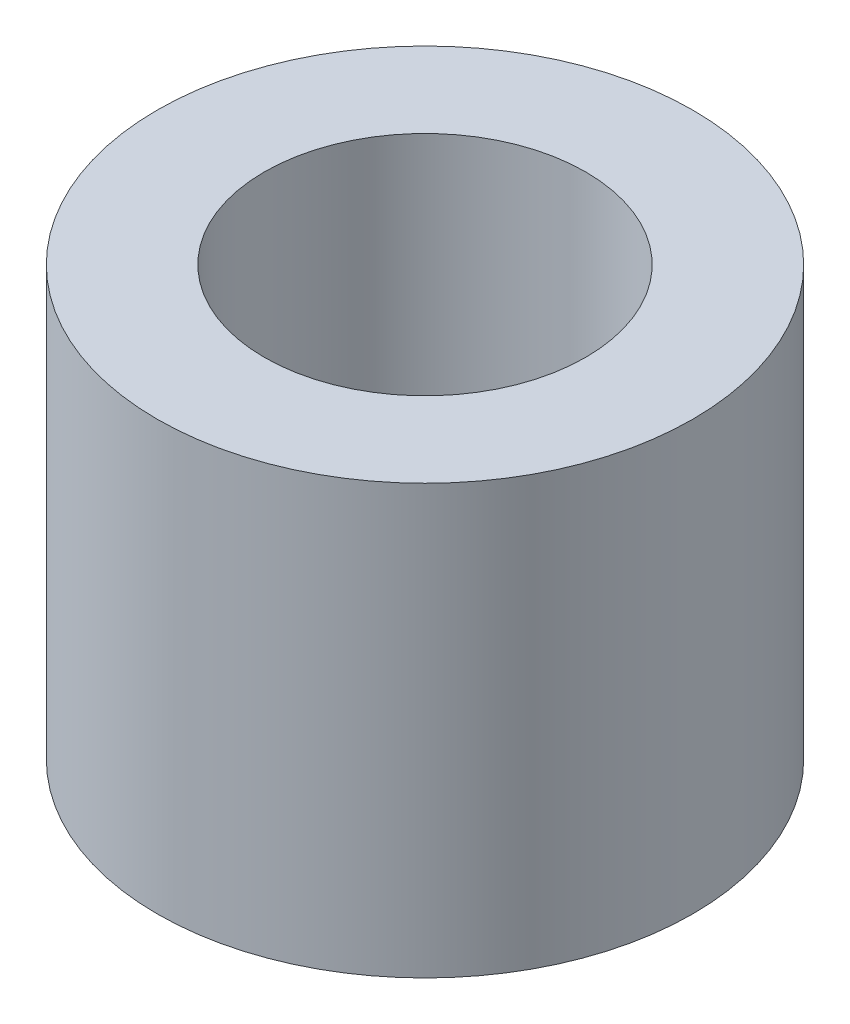
ISO-10303-21;
HEADER;
FILE_DESCRIPTION(('STEP AP214'),'2;1');
FILE_NAME('part.step','',(''),(''),'','','');
FILE_SCHEMA(('AUTOMOTIVE_DESIGN { 1 0 10303 214 1 1 1 1 }'));
ENDSEC;
DATA;
#1=APPLICATION_CONTEXT('core data for automotive mechanical design processes');
#2=APPLICATION_PROTOCOL_DEFINITION('international standard','automotive_design',2000,#1);
#3=PRODUCT_CONTEXT('',#1,'mechanical');
#4=PRODUCT('Part','Part','',(#3));
#5=PRODUCT_RELATED_PRODUCT_CATEGORY('part','',(#4));
#6=PRODUCT_DEFINITION_FORMATION('','',#4);
#7=PRODUCT_DEFINITION_CONTEXT('part definition',#1,'design');
#8=PRODUCT_DEFINITION('design','',#6,#7);
#9=PRODUCT_DEFINITION_SHAPE('','',#8);
#10=(LENGTH_UNIT() NAMED_UNIT(*) SI_UNIT(.MILLI.,.METRE.));
#11=(NAMED_UNIT(*) PLANE_ANGLE_UNIT() SI_UNIT($,.RADIAN.));
#12=(NAMED_UNIT(*) SI_UNIT($,.STERADIAN.) SOLID_ANGLE_UNIT());
#13=UNCERTAINTY_MEASURE_WITH_UNIT(LENGTH_MEASURE(1.E-05),#10,'distance_accuracy_value','');
#14=(GEOMETRIC_REPRESENTATION_CONTEXT(3) GLOBAL_UNCERTAINTY_ASSIGNED_CONTEXT((#13)) GLOBAL_UNIT_ASSIGNED_CONTEXT((#10,
#11,#12)) REPRESENTATION_CONTEXT('',''));
#15=CARTESIAN_POINT('',(0.,0.,0.));
#16=DIRECTION('',(0.,0.,1.));
#17=DIRECTION('',(1.,0.,0.));
#18=AXIS2_PLACEMENT_3D('',#15,#16,#17);
#19=CARTESIAN_POINT('',(0.,4.,0.));
#20=DIRECTION('',(0.,1.,0.));
#21=DIRECTION('',(0.,0.,1.));
#22=AXIS2_PLACEMENT_3D('',#19,#20,#21);
#23=PLANE('',#22);
#24=CARTESIAN_POINT('',(0.,4.,0.));
#25=DIRECTION('',(0.,1.,0.));
#26=DIRECTION('',(0.,0.,1.));
#27=AXIS2_PLACEMENT_3D('',#24,#25,#26);
#28=CIRCLE('',#27,2.5);
#29=CARTESIAN_POINT('',(0.,4.,2.5));
#30=VERTEX_POINT('',#29);
#31=EDGE_CURVE('E10',#30,#30,#28,.T.);
#32=ORIENTED_EDGE('',*,*,#31,.T.);
#33=EDGE_LOOP('',(#32));
#34=FACE_BOUND('',#33,.T.);
#35=CARTESIAN_POINT('',(0.,4.,0.));
#36=DIRECTION('',(0.,1.,0.));
#37=DIRECTION('',(0.,0.,1.));
#38=AXIS2_PLACEMENT_3D('',#35,#36,#37);
#39=CIRCLE('',#38,1.5);
#40=CARTESIAN_POINT('',(0.,4.,1.5));
#41=VERTEX_POINT('',#40);
#42=EDGE_CURVE('E44',#41,#41,#39,.T.);
#43=ORIENTED_EDGE('',*,*,#42,.F.);
#44=EDGE_LOOP('',(#43));
#45=FACE_BOUND('',#44,.T.);
#46=ADVANCED_FACE('F33',(#34,#45),#23,.T.);
#47=CARTESIAN_POINT('',(0.,0.,0.));
#48=DIRECTION('',(0.,1.,0.));
#49=DIRECTION('',(0.,0.,1.));
#50=AXIS2_PLACEMENT_3D('',#47,#48,#49);
#51=PLANE('',#50);
#52=CARTESIAN_POINT('',(0.,0.,0.));
#53=DIRECTION('',(0.,1.,0.));
#54=DIRECTION('',(0.,0.,1.));
#55=AXIS2_PLACEMENT_3D('',#52,#53,#54);
#56=CIRCLE('',#55,2.5);
#57=CARTESIAN_POINT('',(0.,0.,2.5));
#58=VERTEX_POINT('',#57);
#59=EDGE_CURVE('E37',#58,#58,#56,.T.);
#60=ORIENTED_EDGE('',*,*,#59,.F.);
#61=EDGE_LOOP('',(#60));
#62=FACE_BOUND('',#61,.T.);
#63=CARTESIAN_POINT('',(0.,0.,0.));
#64=DIRECTION('',(0.,1.,0.));
#65=DIRECTION('',(0.,0.,1.));
#66=AXIS2_PLACEMENT_3D('',#63,#64,#65);
#67=CIRCLE('',#66,1.5);
#68=CARTESIAN_POINT('',(0.,0.,1.5));
#69=VERTEX_POINT('',#68);
#70=EDGE_CURVE('E46',#69,#69,#67,.T.);
#71=ORIENTED_EDGE('',*,*,#70,.T.);
#72=EDGE_LOOP('',(#71));
#73=FACE_BOUND('',#72,.T.);
#74=ADVANCED_FACE('F56',(#62,#73),#51,.F.);
#75=CARTESIAN_POINT('',(0.,4.,0.));
#76=DIRECTION('',(0.,-1.,0.));
#77=DIRECTION('',(0.,0.,-1.));
#78=AXIS2_PLACEMENT_3D('',#75,#76,#77);
#79=CYLINDRICAL_SURFACE('',#78,2.5);
#80=ORIENTED_EDGE('',*,*,#31,.F.);
#81=EDGE_LOOP('',(#80));
#82=FACE_BOUND('',#81,.T.);
#83=ORIENTED_EDGE('',*,*,#59,.T.);
#84=EDGE_LOOP('',(#83));
#85=FACE_BOUND('',#84,.T.);
#86=ADVANCED_FACE('F35',(#82,#85),#79,.T.);
#87=CARTESIAN_POINT('',(0.,4.,0.));
#88=DIRECTION('',(0.,-1.,0.));
#89=DIRECTION('',(0.,0.,-1.));
#90=AXIS2_PLACEMENT_3D('',#87,#88,#89);
#91=CYLINDRICAL_SURFACE('',#90,1.5);
#92=ORIENTED_EDGE('',*,*,#42,.T.);
#93=EDGE_LOOP('',(#92));
#94=FACE_BOUND('',#93,.T.);
#95=ORIENTED_EDGE('',*,*,#70,.F.);
#96=EDGE_LOOP('',(#95));
#97=FACE_BOUND('',#96,.T.);
#98=ADVANCED_FACE('F52',(#94,#97),#91,.F.);
#99=CLOSED_SHELL('',(#46,#74,#86,#98));
#100=MANIFOLD_SOLID_BREP('B2',#99);
#101=ADVANCED_BREP_SHAPE_REPRESENTATION('',(#18,#100),#14);
#102=SHAPE_DEFINITION_REPRESENTATION(#9,#101);
ENDSEC;
END-ISO-10303-21;
